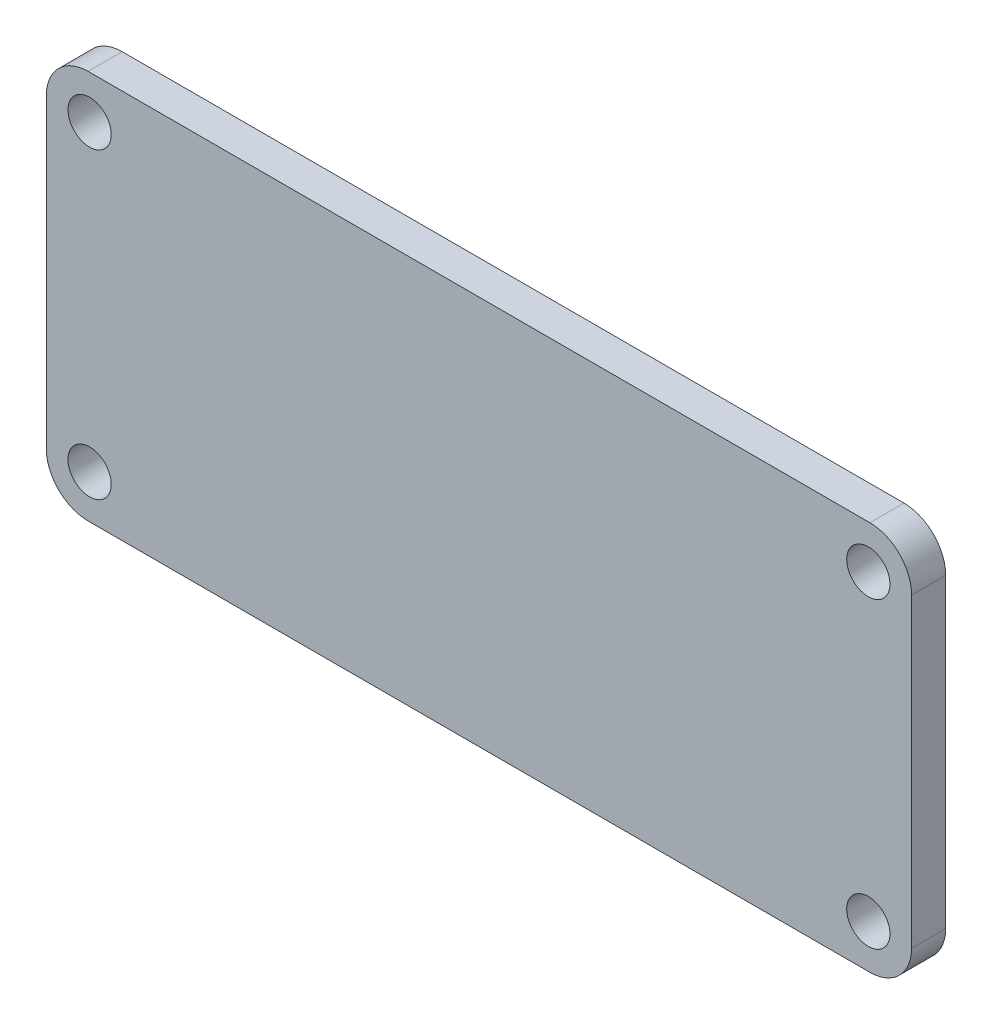
ISO-10303-21;
HEADER;
FILE_DESCRIPTION(('STEP AP214'),'2;1');
FILE_NAME('part.step','',(''),(''),'','','');
FILE_SCHEMA(('AUTOMOTIVE_DESIGN { 1 0 10303 214 1 1 1 1 }'));
ENDSEC;
DATA;
#1=APPLICATION_CONTEXT('core data for automotive mechanical design processes');
#2=APPLICATION_PROTOCOL_DEFINITION('international standard','automotive_design',2000,#1);
#3=PRODUCT_CONTEXT('',#1,'mechanical');
#4=PRODUCT('Part','Part','',(#3));
#5=PRODUCT_RELATED_PRODUCT_CATEGORY('part','',(#4));
#6=PRODUCT_DEFINITION_FORMATION('','',#4);
#7=PRODUCT_DEFINITION_CONTEXT('part definition',#1,'design');
#8=PRODUCT_DEFINITION('design','',#6,#7);
#9=PRODUCT_DEFINITION_SHAPE('','',#8);
#10=(LENGTH_UNIT() NAMED_UNIT(*) SI_UNIT(.MILLI.,.METRE.));
#11=(NAMED_UNIT(*) PLANE_ANGLE_UNIT() SI_UNIT($,.RADIAN.));
#12=(NAMED_UNIT(*) SI_UNIT($,.STERADIAN.) SOLID_ANGLE_UNIT());
#13=UNCERTAINTY_MEASURE_WITH_UNIT(LENGTH_MEASURE(1.E-05),#10,'distance_accuracy_value','');
#14=(GEOMETRIC_REPRESENTATION_CONTEXT(3) GLOBAL_UNCERTAINTY_ASSIGNED_CONTEXT((#13)) GLOBAL_UNIT_ASSIGNED_CONTEXT((#10,
#11,#12)) REPRESENTATION_CONTEXT('',''));
#15=CARTESIAN_POINT('',(0.,0.,0.));
#16=DIRECTION('',(0.,0.,1.));
#17=DIRECTION('',(1.,0.,0.));
#18=AXIS2_PLACEMENT_3D('',#15,#16,#17);
#19=CARTESIAN_POINT('',(22.95,8.98,2.));
#20=DIRECTION('',(0.,0.,1.));
#21=DIRECTION('',(1.,0.,0.));
#22=AXIS2_PLACEMENT_3D('',#19,#20,#21);
#23=PLANE('',#22);
#24=CARTESIAN_POINT('',(22.86,-8.89,2.));
#25=DIRECTION('',(0.,0.,1.));
#26=DIRECTION('',(1.,0.,0.));
#27=AXIS2_PLACEMENT_3D('',#24,#25,#26);
#28=CIRCLE('',#27,1.27);
#29=CARTESIAN_POINT('',(24.13,-8.89,2.));
#30=VERTEX_POINT('',#29);
#31=EDGE_CURVE('E221',#30,#30,#28,.T.);
#32=ORIENTED_EDGE('',*,*,#31,.F.);
#33=EDGE_LOOP('',(#32));
#34=FACE_BOUND('',#33,.T.);
#35=CARTESIAN_POINT('',(-22.86,8.89,2.));
#36=DIRECTION('',(0.,0.,1.));
#37=DIRECTION('',(1.,0.,0.));
#38=AXIS2_PLACEMENT_3D('',#35,#36,#37);
#39=CIRCLE('',#38,1.27);
#40=CARTESIAN_POINT('',(-21.59,8.89,2.));
#41=VERTEX_POINT('',#40);
#42=EDGE_CURVE('E146',#41,#41,#39,.T.);
#43=ORIENTED_EDGE('',*,*,#42,.F.);
#44=EDGE_LOOP('',(#43));
#45=FACE_BOUND('',#44,.T.);
#46=CARTESIAN_POINT('',(22.95,8.98,2.));
#47=DIRECTION('',(0.,0.,1.));
#48=DIRECTION('',(1.,0.,0.));
#49=AXIS2_PLACEMENT_3D('',#46,#47,#48);
#50=CIRCLE('',#49,2.45);
#51=CARTESIAN_POINT('',(25.4,8.97999999999999,2.));
#52=VERTEX_POINT('',#51);
#53=CARTESIAN_POINT('',(22.95,11.43,2.));
#54=VERTEX_POINT('',#53);
#55=EDGE_CURVE('E164',#52,#54,#50,.T.);
#56=ORIENTED_EDGE('',*,*,#55,.T.);
#57=DIRECTION('',(-1.,0.,0.));
#58=VECTOR('',#57,1.);
#59=CARTESIAN_POINT('',(22.95,11.43,2.));
#60=LINE('',#59,#58);
#61=CARTESIAN_POINT('',(-22.95,11.43,2.));
#62=VERTEX_POINT('',#61);
#63=EDGE_CURVE('E100',#54,#62,#60,.T.);
#64=ORIENTED_EDGE('',*,*,#63,.T.);
#65=CARTESIAN_POINT('',(-22.95,8.98,2.));
#66=DIRECTION('',(0.,0.,1.));
#67=DIRECTION('',(1.,0.,0.));
#68=AXIS2_PLACEMENT_3D('',#65,#66,#67);
#69=CIRCLE('',#68,2.45);
#70=CARTESIAN_POINT('',(-25.4,8.97999999999998,2.));
#71=VERTEX_POINT('',#70);
#72=EDGE_CURVE('E185',#62,#71,#69,.T.);
#73=ORIENTED_EDGE('',*,*,#72,.T.);
#74=DIRECTION('',(0.,-1.,0.));
#75=VECTOR('',#74,1.);
#76=CARTESIAN_POINT('',(-25.4,-8.97999999999998,2.));
#77=LINE('',#76,#75);
#78=CARTESIAN_POINT('',(-25.4,-8.98,2.));
#79=VERTEX_POINT('',#78);
#80=EDGE_CURVE('E199',#71,#79,#77,.T.);
#81=ORIENTED_EDGE('',*,*,#80,.T.);
#82=CARTESIAN_POINT('',(-22.95,-8.98,2.));
#83=DIRECTION('',(0.,0.,1.));
#84=DIRECTION('',(-1.,0.,0.));
#85=AXIS2_PLACEMENT_3D('',#82,#83,#84);
#86=CIRCLE('',#85,2.45);
#87=CARTESIAN_POINT('',(-22.95,-11.43,2.));
#88=VERTEX_POINT('',#87);
#89=EDGE_CURVE('E119',#79,#88,#86,.T.);
#90=ORIENTED_EDGE('',*,*,#89,.T.);
#91=DIRECTION('',(1.,0.,0.));
#92=VECTOR('',#91,1.);
#93=CARTESIAN_POINT('',(22.95,-11.43,2.));
#94=LINE('',#93,#92);
#95=CARTESIAN_POINT('',(22.95,-11.43,2.));
#96=VERTEX_POINT('',#95);
#97=EDGE_CURVE('E113',#88,#96,#94,.T.);
#98=ORIENTED_EDGE('',*,*,#97,.T.);
#99=CARTESIAN_POINT('',(22.95,-8.98,2.));
#100=DIRECTION('',(0.,0.,1.));
#101=DIRECTION('',(-1.,0.,0.));
#102=AXIS2_PLACEMENT_3D('',#99,#100,#101);
#103=CIRCLE('',#102,2.45);
#104=CARTESIAN_POINT('',(25.4,-8.97999999999998,2.));
#105=VERTEX_POINT('',#104);
#106=EDGE_CURVE('E117',#96,#105,#103,.T.);
#107=ORIENTED_EDGE('',*,*,#106,.T.);
#108=DIRECTION('',(0.,1.,0.));
#109=VECTOR('',#108,1.);
#110=CARTESIAN_POINT('',(25.4,-8.97999999999998,2.));
#111=LINE('',#110,#109);
#112=EDGE_CURVE('E57',#105,#52,#111,.T.);
#113=ORIENTED_EDGE('',*,*,#112,.T.);
#114=EDGE_LOOP('',(#56,#64,#73,#81,#90,#98,#107,#113));
#115=FACE_BOUND('',#114,.T.);
#116=CARTESIAN_POINT('',(-22.86,-8.89,2.));
#117=DIRECTION('',(0.,0.,1.));
#118=DIRECTION('',(-1.,0.,0.));
#119=AXIS2_PLACEMENT_3D('',#116,#117,#118);
#120=CIRCLE('',#119,1.27);
#121=CARTESIAN_POINT('',(-24.13,-8.89,2.));
#122=VERTEX_POINT('',#121);
#123=EDGE_CURVE('E213',#122,#122,#120,.T.);
#124=ORIENTED_EDGE('',*,*,#123,.F.);
#125=EDGE_LOOP('',(#124));
#126=FACE_BOUND('',#125,.T.);
#127=CARTESIAN_POINT('',(22.86,8.89,2.));
#128=DIRECTION('',(0.,0.,1.));
#129=DIRECTION('',(-1.,0.,0.));
#130=AXIS2_PLACEMENT_3D('',#127,#128,#129);
#131=CIRCLE('',#130,1.27);
#132=CARTESIAN_POINT('',(21.59,8.89,2.));
#133=VERTEX_POINT('',#132);
#134=EDGE_CURVE('E229',#133,#133,#131,.T.);
#135=ORIENTED_EDGE('',*,*,#134,.F.);
#136=EDGE_LOOP('',(#135));
#137=FACE_BOUND('',#136,.T.);
#138=ADVANCED_FACE('F39',(#34,#45,#115,#126,#137),#23,.T.);
#139=CARTESIAN_POINT('',(22.95,8.98,0.));
#140=DIRECTION('',(0.,0.,1.));
#141=DIRECTION('',(1.,0.,0.));
#142=AXIS2_PLACEMENT_3D('',#139,#140,#141);
#143=PLANE('',#142);
#144=CARTESIAN_POINT('',(22.95,8.98,0.));
#145=DIRECTION('',(0.,0.,1.));
#146=DIRECTION('',(1.,0.,0.));
#147=AXIS2_PLACEMENT_3D('',#144,#145,#146);
#148=CIRCLE('',#147,2.45);
#149=CARTESIAN_POINT('',(25.4,8.97999999999999,0.));
#150=VERTEX_POINT('',#149);
#151=CARTESIAN_POINT('',(22.95,11.43,0.));
#152=VERTEX_POINT('',#151);
#153=EDGE_CURVE('E141',#150,#152,#148,.T.);
#154=ORIENTED_EDGE('',*,*,#153,.F.);
#155=DIRECTION('',(0.,1.,0.));
#156=VECTOR('',#155,1.);
#157=CARTESIAN_POINT('',(25.4,-8.97999999999998,0.));
#158=LINE('',#157,#156);
#159=CARTESIAN_POINT('',(25.4,-8.97999999999998,0.));
#160=VERTEX_POINT('',#159);
#161=EDGE_CURVE('E92',#160,#150,#158,.T.);
#162=ORIENTED_EDGE('',*,*,#161,.F.);
#163=CARTESIAN_POINT('',(22.95,-8.98,0.));
#164=DIRECTION('',(0.,0.,1.));
#165=DIRECTION('',(-1.,0.,0.));
#166=AXIS2_PLACEMENT_3D('',#163,#164,#165);
#167=CIRCLE('',#166,2.45);
#168=CARTESIAN_POINT('',(22.95,-11.43,0.));
#169=VERTEX_POINT('',#168);
#170=EDGE_CURVE('E86',#169,#160,#167,.T.);
#171=ORIENTED_EDGE('',*,*,#170,.F.);
#172=DIRECTION('',(1.,0.,0.));
#173=VECTOR('',#172,1.);
#174=CARTESIAN_POINT('',(22.95,-11.43,0.));
#175=LINE('',#174,#173);
#176=CARTESIAN_POINT('',(-22.95,-11.43,0.));
#177=VERTEX_POINT('',#176);
#178=EDGE_CURVE('E128',#177,#169,#175,.T.);
#179=ORIENTED_EDGE('',*,*,#178,.F.);
#180=CARTESIAN_POINT('',(-22.95,-8.98,0.));
#181=DIRECTION('',(0.,0.,1.));
#182=DIRECTION('',(-1.,0.,0.));
#183=AXIS2_PLACEMENT_3D('',#180,#181,#182);
#184=CIRCLE('',#183,2.45);
#185=CARTESIAN_POINT('',(-25.4,-8.98,0.));
#186=VERTEX_POINT('',#185);
#187=EDGE_CURVE('E155',#186,#177,#184,.T.);
#188=ORIENTED_EDGE('',*,*,#187,.F.);
#189=DIRECTION('',(0.,-1.,0.));
#190=VECTOR('',#189,1.);
#191=CARTESIAN_POINT('',(-25.4,-8.97999999999998,0.));
#192=LINE('',#191,#190);
#193=CARTESIAN_POINT('',(-25.4,8.97999999999998,0.));
#194=VERTEX_POINT('',#193);
#195=EDGE_CURVE('E152',#194,#186,#192,.T.);
#196=ORIENTED_EDGE('',*,*,#195,.F.);
#197=CARTESIAN_POINT('',(-22.95,8.98,0.));
#198=DIRECTION('',(0.,0.,1.));
#199=DIRECTION('',(1.,0.,0.));
#200=AXIS2_PLACEMENT_3D('',#197,#198,#199);
#201=CIRCLE('',#200,2.45);
#202=CARTESIAN_POINT('',(-22.95,11.43,0.));
#203=VERTEX_POINT('',#202);
#204=EDGE_CURVE('E149',#203,#194,#201,.T.);
#205=ORIENTED_EDGE('',*,*,#204,.F.);
#206=DIRECTION('',(-1.,0.,0.));
#207=VECTOR('',#206,1.);
#208=CARTESIAN_POINT('',(22.95,11.43,0.));
#209=LINE('',#208,#207);
#210=EDGE_CURVE('E145',#152,#203,#209,.T.);
#211=ORIENTED_EDGE('',*,*,#210,.F.);
#212=EDGE_LOOP('',(#154,#162,#171,#179,#188,#196,#205,#211));
#213=FACE_BOUND('',#212,.T.);
#214=CARTESIAN_POINT('',(-22.86,8.89,0.));
#215=DIRECTION('',(0.,0.,1.));
#216=DIRECTION('',(1.,0.,0.));
#217=AXIS2_PLACEMENT_3D('',#214,#215,#216);
#218=CIRCLE('',#217,1.27);
#219=CARTESIAN_POINT('',(-21.59,8.89,0.));
#220=VERTEX_POINT('',#219);
#221=EDGE_CURVE('E209',#220,#220,#218,.T.);
#222=ORIENTED_EDGE('',*,*,#221,.T.);
#223=EDGE_LOOP('',(#222));
#224=FACE_BOUND('',#223,.T.);
#225=CARTESIAN_POINT('',(-22.86,-8.89,0.));
#226=DIRECTION('',(0.,0.,1.));
#227=DIRECTION('',(-1.,0.,0.));
#228=AXIS2_PLACEMENT_3D('',#225,#226,#227);
#229=CIRCLE('',#228,1.27);
#230=CARTESIAN_POINT('',(-24.13,-8.89,0.));
#231=VERTEX_POINT('',#230);
#232=EDGE_CURVE('E217',#231,#231,#229,.T.);
#233=ORIENTED_EDGE('',*,*,#232,.T.);
#234=EDGE_LOOP('',(#233));
#235=FACE_BOUND('',#234,.T.);
#236=CARTESIAN_POINT('',(22.86,-8.89,0.));
#237=DIRECTION('',(0.,0.,1.));
#238=DIRECTION('',(1.,0.,0.));
#239=AXIS2_PLACEMENT_3D('',#236,#237,#238);
#240=CIRCLE('',#239,1.27);
#241=CARTESIAN_POINT('',(24.13,-8.89,0.));
#242=VERTEX_POINT('',#241);
#243=EDGE_CURVE('E225',#242,#242,#240,.T.);
#244=ORIENTED_EDGE('',*,*,#243,.T.);
#245=EDGE_LOOP('',(#244));
#246=FACE_BOUND('',#245,.T.);
#247=CARTESIAN_POINT('',(22.86,8.89,0.));
#248=DIRECTION('',(0.,0.,1.));
#249=DIRECTION('',(-1.,0.,0.));
#250=AXIS2_PLACEMENT_3D('',#247,#248,#249);
#251=CIRCLE('',#250,1.27);
#252=CARTESIAN_POINT('',(21.59,8.89,0.));
#253=VERTEX_POINT('',#252);
#254=EDGE_CURVE('E233',#253,#253,#251,.T.);
#255=ORIENTED_EDGE('',*,*,#254,.T.);
#256=EDGE_LOOP('',(#255));
#257=FACE_BOUND('',#256,.T.);
#258=ADVANCED_FACE('F189',(#213,#224,#235,#246,#257),#143,.F.);
#259=CARTESIAN_POINT('',(22.95,8.98,2.));
#260=DIRECTION('',(0.,0.,-1.));
#261=DIRECTION('',(-1.,0.,0.));
#262=AXIS2_PLACEMENT_3D('',#259,#260,#261);
#263=CYLINDRICAL_SURFACE('',#262,2.45);
#264=ORIENTED_EDGE('',*,*,#153,.T.);
#265=DIRECTION('',(0.,0.,-1.));
#266=VECTOR('',#265,1.);
#267=CARTESIAN_POINT('',(22.95,11.43,2.));
#268=LINE('',#267,#266);
#269=EDGE_CURVE('E11',#54,#152,#268,.T.);
#270=ORIENTED_EDGE('',*,*,#269,.F.);
#271=ORIENTED_EDGE('',*,*,#55,.F.);
#272=DIRECTION('',(0.,0.,-1.));
#273=VECTOR('',#272,1.);
#274=CARTESIAN_POINT('',(25.4,8.97999999999999,2.));
#275=LINE('',#274,#273);
#276=EDGE_CURVE('E137',#52,#150,#275,.T.);
#277=ORIENTED_EDGE('',*,*,#276,.T.);
#278=EDGE_LOOP('',(#264,#270,#271,#277));
#279=FACE_BOUND('',#278,.T.);
#280=ADVANCED_FACE('F41',(#279),#263,.T.);
#281=CARTESIAN_POINT('',(22.95,11.43,2.));
#282=DIRECTION('',(0.,-1.,0.));
#283=DIRECTION('',(1.,0.,0.));
#284=AXIS2_PLACEMENT_3D('',#281,#282,#283);
#285=PLANE('',#284);
#286=ORIENTED_EDGE('',*,*,#210,.T.);
#287=DIRECTION('',(0.,0.,-1.));
#288=VECTOR('',#287,1.);
#289=CARTESIAN_POINT('',(-22.95,11.43,2.));
#290=LINE('',#289,#288);
#291=EDGE_CURVE('E49',#62,#203,#290,.T.);
#292=ORIENTED_EDGE('',*,*,#291,.F.);
#293=ORIENTED_EDGE('',*,*,#63,.F.);
#294=ORIENTED_EDGE('',*,*,#269,.T.);
#295=EDGE_LOOP('',(#286,#292,#293,#294));
#296=FACE_BOUND('',#295,.T.);
#297=ADVANCED_FACE('F269',(#296),#285,.F.);
#298=CARTESIAN_POINT('',(-22.95,8.98,2.));
#299=DIRECTION('',(0.,0.,-1.));
#300=DIRECTION('',(-1.,0.,0.));
#301=AXIS2_PLACEMENT_3D('',#298,#299,#300);
#302=CYLINDRICAL_SURFACE('',#301,2.45);
#303=ORIENTED_EDGE('',*,*,#204,.T.);
#304=DIRECTION('',(0.,0.,-1.));
#305=VECTOR('',#304,1.);
#306=CARTESIAN_POINT('',(-25.4,8.97999999999998,2.));
#307=LINE('',#306,#305);
#308=EDGE_CURVE('E175',#71,#194,#307,.T.);
#309=ORIENTED_EDGE('',*,*,#308,.F.);
#310=ORIENTED_EDGE('',*,*,#72,.F.);
#311=ORIENTED_EDGE('',*,*,#291,.T.);
#312=EDGE_LOOP('',(#303,#309,#310,#311));
#313=FACE_BOUND('',#312,.T.);
#314=ADVANCED_FACE('F183',(#313),#302,.T.);
#315=CARTESIAN_POINT('',(-25.4,-8.97999999999998,2.));
#316=DIRECTION('',(1.,0.,0.));
#317=DIRECTION('',(0.,0.,-1.));
#318=AXIS2_PLACEMENT_3D('',#315,#316,#317);
#319=PLANE('',#318);
#320=ORIENTED_EDGE('',*,*,#195,.T.);
#321=DIRECTION('',(0.,0.,-1.));
#322=VECTOR('',#321,1.);
#323=CARTESIAN_POINT('',(-25.4,-8.98,2.));
#324=LINE('',#323,#322);
#325=EDGE_CURVE('E171',#79,#186,#324,.T.);
#326=ORIENTED_EDGE('',*,*,#325,.F.);
#327=ORIENTED_EDGE('',*,*,#80,.F.);
#328=ORIENTED_EDGE('',*,*,#308,.T.);
#329=EDGE_LOOP('',(#320,#326,#327,#328));
#330=FACE_BOUND('',#329,.T.);
#331=ADVANCED_FACE('F194',(#330),#319,.F.);
#332=CARTESIAN_POINT('',(-22.95,-8.98,2.));
#333=DIRECTION('',(0.,0.,-1.));
#334=DIRECTION('',(-1.,0.,0.));
#335=AXIS2_PLACEMENT_3D('',#332,#333,#334);
#336=CYLINDRICAL_SURFACE('',#335,2.45);
#337=ORIENTED_EDGE('',*,*,#187,.T.);
#338=DIRECTION('',(0.,0.,-1.));
#339=VECTOR('',#338,1.);
#340=CARTESIAN_POINT('',(-22.95,-11.43,2.));
#341=LINE('',#340,#339);
#342=EDGE_CURVE('E130',#88,#177,#341,.T.);
#343=ORIENTED_EDGE('',*,*,#342,.F.);
#344=ORIENTED_EDGE('',*,*,#89,.F.);
#345=ORIENTED_EDGE('',*,*,#325,.T.);
#346=EDGE_LOOP('',(#337,#343,#344,#345));
#347=FACE_BOUND('',#346,.T.);
#348=ADVANCED_FACE('F197',(#347),#336,.T.);
#349=CARTESIAN_POINT('',(22.95,-11.43,2.));
#350=DIRECTION('',(0.,1.,0.));
#351=DIRECTION('',(-1.,0.,0.));
#352=AXIS2_PLACEMENT_3D('',#349,#350,#351);
#353=PLANE('',#352);
#354=ORIENTED_EDGE('',*,*,#178,.T.);
#355=DIRECTION('',(0.,0.,-1.));
#356=VECTOR('',#355,1.);
#357=CARTESIAN_POINT('',(22.95,-11.43,2.));
#358=LINE('',#357,#356);
#359=EDGE_CURVE('E125',#96,#169,#358,.T.);
#360=ORIENTED_EDGE('',*,*,#359,.F.);
#361=ORIENTED_EDGE('',*,*,#97,.F.);
#362=ORIENTED_EDGE('',*,*,#342,.T.);
#363=EDGE_LOOP('',(#354,#360,#361,#362));
#364=FACE_BOUND('',#363,.T.);
#365=ADVANCED_FACE('F126',(#364),#353,.F.);
#366=CARTESIAN_POINT('',(22.95,-8.98,2.));
#367=DIRECTION('',(0.,0.,-1.));
#368=DIRECTION('',(-1.,0.,0.));
#369=AXIS2_PLACEMENT_3D('',#366,#367,#368);
#370=CYLINDRICAL_SURFACE('',#369,2.45);
#371=ORIENTED_EDGE('',*,*,#170,.T.);
#372=DIRECTION('',(0.,0.,-1.));
#373=VECTOR('',#372,1.);
#374=CARTESIAN_POINT('',(25.4,-8.97999999999998,2.));
#375=LINE('',#374,#373);
#376=EDGE_CURVE('E131',#105,#160,#375,.T.);
#377=ORIENTED_EDGE('',*,*,#376,.F.);
#378=ORIENTED_EDGE('',*,*,#106,.F.);
#379=ORIENTED_EDGE('',*,*,#359,.T.);
#380=EDGE_LOOP('',(#371,#377,#378,#379));
#381=FACE_BOUND('',#380,.T.);
#382=ADVANCED_FACE('F133',(#381),#370,.T.);
#383=CARTESIAN_POINT('',(25.4,-8.97999999999998,2.));
#384=DIRECTION('',(-1.,0.,0.));
#385=DIRECTION('',(0.,0.,1.));
#386=AXIS2_PLACEMENT_3D('',#383,#384,#385);
#387=PLANE('',#386);
#388=ORIENTED_EDGE('',*,*,#161,.T.);
#389=ORIENTED_EDGE('',*,*,#276,.F.);
#390=ORIENTED_EDGE('',*,*,#112,.F.);
#391=ORIENTED_EDGE('',*,*,#376,.T.);
#392=EDGE_LOOP('',(#388,#389,#390,#391));
#393=FACE_BOUND('',#392,.T.);
#394=ADVANCED_FACE('F257',(#393),#387,.F.);
#395=CARTESIAN_POINT('',(-22.86,8.89,2.));
#396=DIRECTION('',(0.,0.,-1.));
#397=DIRECTION('',(-1.,0.,0.));
#398=AXIS2_PLACEMENT_3D('',#395,#396,#397);
#399=CYLINDRICAL_SURFACE('',#398,1.27);
#400=ORIENTED_EDGE('',*,*,#42,.T.);
#401=EDGE_LOOP('',(#400));
#402=FACE_BOUND('',#401,.T.);
#403=ORIENTED_EDGE('',*,*,#221,.F.);
#404=EDGE_LOOP('',(#403));
#405=FACE_BOUND('',#404,.T.);
#406=ADVANCED_FACE('F254',(#402,#405),#399,.F.);
#407=CARTESIAN_POINT('',(-22.86,-8.89,2.));
#408=DIRECTION('',(0.,0.,-1.));
#409=DIRECTION('',(-1.,0.,0.));
#410=AXIS2_PLACEMENT_3D('',#407,#408,#409);
#411=CYLINDRICAL_SURFACE('',#410,1.27);
#412=ORIENTED_EDGE('',*,*,#123,.T.);
#413=EDGE_LOOP('',(#412));
#414=FACE_BOUND('',#413,.T.);
#415=ORIENTED_EDGE('',*,*,#232,.F.);
#416=EDGE_LOOP('',(#415));
#417=FACE_BOUND('',#416,.T.);
#418=ADVANCED_FACE('F333',(#414,#417),#411,.F.);
#419=CARTESIAN_POINT('',(22.86,-8.89,2.));
#420=DIRECTION('',(0.,0.,-1.));
#421=DIRECTION('',(-1.,0.,0.));
#422=AXIS2_PLACEMENT_3D('',#419,#420,#421);
#423=CYLINDRICAL_SURFACE('',#422,1.27);
#424=ORIENTED_EDGE('',*,*,#31,.T.);
#425=EDGE_LOOP('',(#424));
#426=FACE_BOUND('',#425,.T.);
#427=ORIENTED_EDGE('',*,*,#243,.F.);
#428=EDGE_LOOP('',(#427));
#429=FACE_BOUND('',#428,.T.);
#430=ADVANCED_FACE('F341',(#426,#429),#423,.F.);
#431=CARTESIAN_POINT('',(22.86,8.89,2.));
#432=DIRECTION('',(0.,0.,-1.));
#433=DIRECTION('',(-1.,0.,0.));
#434=AXIS2_PLACEMENT_3D('',#431,#432,#433);
#435=CYLINDRICAL_SURFACE('',#434,1.27);
#436=ORIENTED_EDGE('',*,*,#134,.T.);
#437=EDGE_LOOP('',(#436));
#438=FACE_BOUND('',#437,.T.);
#439=ORIENTED_EDGE('',*,*,#254,.F.);
#440=EDGE_LOOP('',(#439));
#441=FACE_BOUND('',#440,.T.);
#442=ADVANCED_FACE('F241',(#438,#441),#435,.F.);
#443=CLOSED_SHELL('',(#138,#258,#280,#297,#314,#331,#348,#365,#382,#394,#406,#418,#430,#442));
#444=MANIFOLD_SOLID_BREP('B2',#443);
#445=ADVANCED_BREP_SHAPE_REPRESENTATION('',(#18,#444),#14);
#446=SHAPE_DEFINITION_REPRESENTATION(#9,#445);
ENDSEC;
END-ISO-10303-21;
